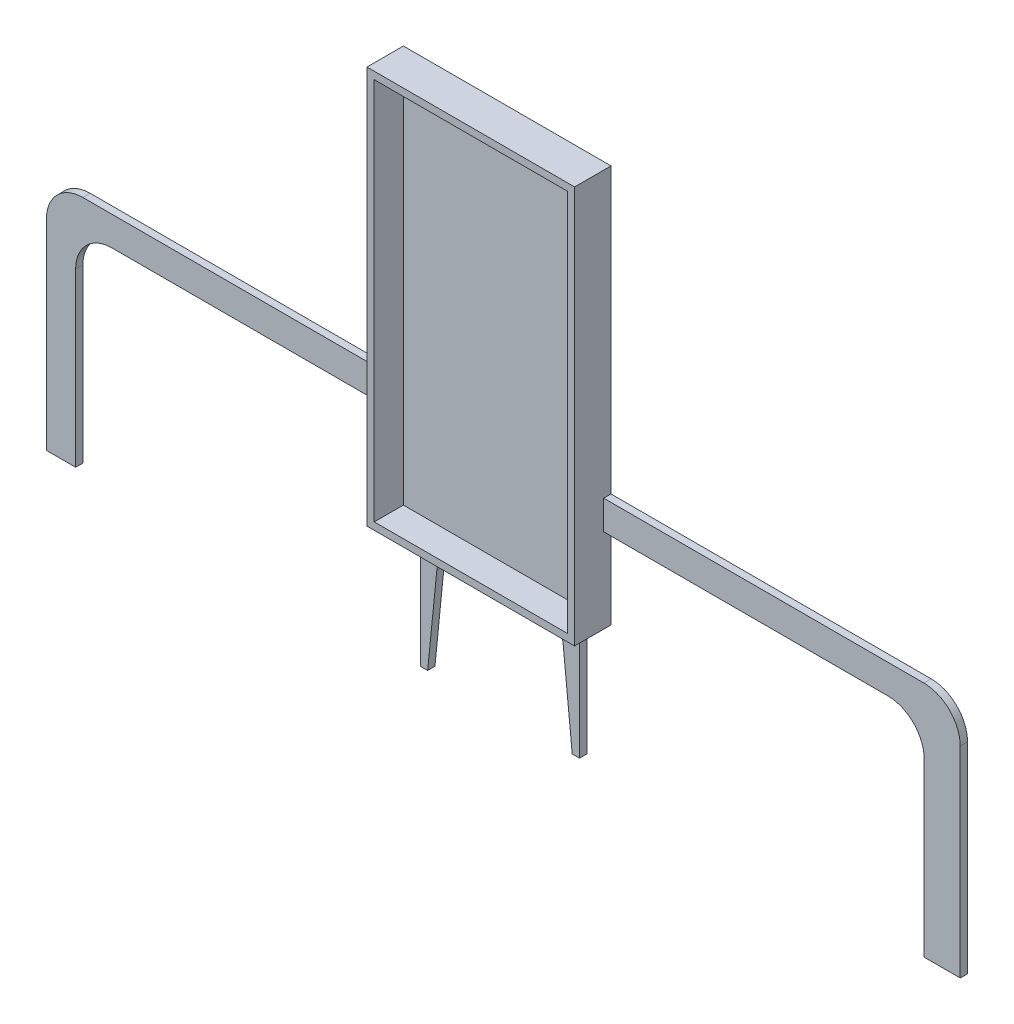
ISO-10303-21;
HEADER;
FILE_DESCRIPTION(('STEP AP214'),'2;1');
FILE_NAME('part.step','',(''),(''),'','','');
FILE_SCHEMA(('AUTOMOTIVE_DESIGN { 1 0 10303 214 1 1 1 1 }'));
ENDSEC;
DATA;
#1=APPLICATION_CONTEXT('core data for automotive mechanical design processes');
#2=APPLICATION_PROTOCOL_DEFINITION('international standard','automotive_design',2000,#1);
#3=PRODUCT_CONTEXT('',#1,'mechanical');
#4=PRODUCT('Part','Part','',(#3));
#5=PRODUCT_RELATED_PRODUCT_CATEGORY('part','',(#4));
#6=PRODUCT_DEFINITION_FORMATION('','',#4);
#7=PRODUCT_DEFINITION_CONTEXT('part definition',#1,'design');
#8=PRODUCT_DEFINITION('design','',#6,#7);
#9=PRODUCT_DEFINITION_SHAPE('','',#8);
#10=(LENGTH_UNIT() NAMED_UNIT(*) SI_UNIT(.MILLI.,.METRE.));
#11=(NAMED_UNIT(*) PLANE_ANGLE_UNIT() SI_UNIT($,.RADIAN.));
#12=(NAMED_UNIT(*) SI_UNIT($,.STERADIAN.) SOLID_ANGLE_UNIT());
#13=UNCERTAINTY_MEASURE_WITH_UNIT(LENGTH_MEASURE(1.E-05),#10,'distance_accuracy_value','');
#14=(GEOMETRIC_REPRESENTATION_CONTEXT(3) GLOBAL_UNCERTAINTY_ASSIGNED_CONTEXT((#13)) GLOBAL_UNIT_ASSIGNED_CONTEXT((#10,
#11,#12)) REPRESENTATION_CONTEXT('',''));
#15=CARTESIAN_POINT('',(0.,0.,0.));
#16=DIRECTION('',(0.,0.,1.));
#17=DIRECTION('',(1.,0.,0.));
#18=AXIS2_PLACEMENT_3D('',#15,#16,#17);
#19=CARTESIAN_POINT('',(0.,0.,1.));
#20=DIRECTION('',(0.,0.,1.));
#21=DIRECTION('',(1.,0.,0.));
#22=AXIS2_PLACEMENT_3D('',#19,#20,#21);
#23=PLANE('',#22);
#24=DIRECTION('',(0.,-1.,0.));
#25=VECTOR('',#24,1.);
#26=CARTESIAN_POINT('',(47.985038200003,17.,1.));
#27=LINE('',#26,#25);
#28=CARTESIAN_POINT('',(47.985038200003,32.5695975115487,1.));
#29=VERTEX_POINT('',#28);
#30=CARTESIAN_POINT('',(47.985038200003,28.5695975115487,1.));
#31=VERTEX_POINT('',#30);
#32=EDGE_CURVE('E12',#29,#31,#27,.T.);
#33=ORIENTED_EDGE('',*,*,#32,.F.);
#34=DIRECTION('',(1.,0.,0.));
#35=VECTOR('',#34,1.);
#36=CARTESIAN_POINT('',(0.,32.5695975115487,1.));
#37=LINE('',#36,#35);
#38=CARTESIAN_POINT('',(5.00000000000004,32.5695975115487,1.));
#39=VERTEX_POINT('',#38);
#40=EDGE_CURVE('E520',#39,#29,#37,.T.);
#41=ORIENTED_EDGE('',*,*,#40,.F.);
#42=CARTESIAN_POINT('',(5.,27.5695975115488,1.));
#43=DIRECTION('',(0.,0.,1.));
#44=DIRECTION('',(1.,0.,0.));
#45=AXIS2_PLACEMENT_3D('',#42,#43,#44);
#46=CIRCLE('',#45,5.);
#47=CARTESIAN_POINT('',(0.,27.5695975115487,1.));
#48=VERTEX_POINT('',#47);
#49=EDGE_CURVE('E522',#48,#39,#46,.F.);
#50=ORIENTED_EDGE('',*,*,#49,.F.);
#51=DIRECTION('',(0.,1.,0.));
#52=VECTOR('',#51,1.);
#53=CARTESIAN_POINT('',(0.,0.,1.));
#54=LINE('',#53,#52);
#55=CARTESIAN_POINT('',(0.,0.,1.));
#56=VERTEX_POINT('',#55);
#57=EDGE_CURVE('E549',#56,#48,#54,.T.);
#58=ORIENTED_EDGE('',*,*,#57,.F.);
#59=DIRECTION('',(1.,0.,0.));
#60=VECTOR('',#59,1.);
#61=CARTESIAN_POINT('',(0.,0.,1.));
#62=LINE('',#61,#60);
#63=CARTESIAN_POINT('',(4.,0.,1.));
#64=VERTEX_POINT('',#63);
#65=EDGE_CURVE('E546',#56,#64,#62,.T.);
#66=ORIENTED_EDGE('',*,*,#65,.T.);
#67=DIRECTION('',(0.,1.,0.));
#68=VECTOR('',#67,1.);
#69=CARTESIAN_POINT('',(4.,0.,1.));
#70=LINE('',#69,#68);
#71=CARTESIAN_POINT('',(4.,23.5695975115487,1.));
#72=VERTEX_POINT('',#71);
#73=EDGE_CURVE('E543',#64,#72,#70,.T.);
#74=ORIENTED_EDGE('',*,*,#73,.T.);
#75=CARTESIAN_POINT('',(9.,23.5695975115488,1.));
#76=DIRECTION('',(0.,0.,1.));
#77=DIRECTION('',(1.,0.,0.));
#78=AXIS2_PLACEMENT_3D('',#75,#76,#77);
#79=CIRCLE('',#78,5.);
#80=CARTESIAN_POINT('',(9.00000000000004,28.5695975115487,1.));
#81=VERTEX_POINT('',#80);
#82=EDGE_CURVE('E540',#72,#81,#79,.F.);
#83=ORIENTED_EDGE('',*,*,#82,.T.);
#84=DIRECTION('',(1.,0.,0.));
#85=VECTOR('',#84,1.);
#86=CARTESIAN_POINT('',(0.,28.5695975115487,1.));
#87=LINE('',#86,#85);
#88=EDGE_CURVE('E537',#81,#31,#87,.T.);
#89=ORIENTED_EDGE('',*,*,#88,.T.);
#90=EDGE_LOOP('',(#33,#41,#50,#58,#66,#74,#83,#89));
#91=FACE_BOUND('',#90,.T.);
#92=ADVANCED_FACE('F113',(#91),#23,.T.);
#93=DIRECTION('',(0.,1.,0.));
#94=VECTOR('',#93,1.);
#95=CARTESIAN_POINT('',(76.485038200003,71.5695975115488,1.));
#96=LINE('',#95,#94);
#97=CARTESIAN_POINT('',(76.485038200003,28.5695975115487,1.));
#98=VERTEX_POINT('',#97);
#99=CARTESIAN_POINT('',(76.485038200003,32.5695975115487,1.));
#100=VERTEX_POINT('',#99);
#101=EDGE_CURVE('E122',#98,#100,#96,.T.);
#102=ORIENTED_EDGE('',*,*,#101,.F.);
#103=DIRECTION('',(1.,0.,0.));
#104=VECTOR('',#103,1.);
#105=CARTESIAN_POINT('',(0.,28.5695975115487,1.));
#106=LINE('',#105,#104);
#107=CARTESIAN_POINT('',(115.470076400006,28.5695975115487,1.));
#108=VERTEX_POINT('',#107);
#109=EDGE_CURVE('E494',#98,#108,#106,.T.);
#110=ORIENTED_EDGE('',*,*,#109,.T.);
#111=CARTESIAN_POINT('',(115.470076400006,23.5695975115488,1.));
#112=DIRECTION('',(0.,0.,1.));
#113=DIRECTION('',(1.,0.,0.));
#114=AXIS2_PLACEMENT_3D('',#111,#112,#113);
#115=CIRCLE('',#114,5.);
#116=CARTESIAN_POINT('',(120.470076400006,23.5695975115487,1.));
#117=VERTEX_POINT('',#116);
#118=EDGE_CURVE('E492',#108,#117,#115,.F.);
#119=ORIENTED_EDGE('',*,*,#118,.T.);
#120=DIRECTION('',(0.,-1.,0.));
#121=VECTOR('',#120,1.);
#122=CARTESIAN_POINT('',(120.470076400006,0.,1.));
#123=LINE('',#122,#121);
#124=CARTESIAN_POINT('',(120.470076400006,0.,1.));
#125=VERTEX_POINT('',#124);
#126=EDGE_CURVE('E490',#117,#125,#123,.T.);
#127=ORIENTED_EDGE('',*,*,#126,.T.);
#128=DIRECTION('',(1.,0.,0.));
#129=VECTOR('',#128,1.);
#130=CARTESIAN_POINT('',(0.,0.,1.));
#131=LINE('',#130,#129);
#132=CARTESIAN_POINT('',(125.415873255215,0.,1.));
#133=VERTEX_POINT('',#132);
#134=EDGE_CURVE('E488',#125,#133,#131,.T.);
#135=ORIENTED_EDGE('',*,*,#134,.T.);
#136=DIRECTION('',(0.,-1.,0.));
#137=VECTOR('',#136,1.);
#138=CARTESIAN_POINT('',(125.415873255215,0.,1.));
#139=LINE('',#138,#137);
#140=CARTESIAN_POINT('',(125.415873255215,27.5695975115487,1.));
#141=VERTEX_POINT('',#140);
#142=EDGE_CURVE('E467',#141,#133,#139,.T.);
#143=ORIENTED_EDGE('',*,*,#142,.F.);
#144=CARTESIAN_POINT('',(120.415873255215,27.5695975115488,1.));
#145=DIRECTION('',(0.,0.,1.));
#146=DIRECTION('',(1.,0.,0.));
#147=AXIS2_PLACEMENT_3D('',#144,#145,#146);
#148=CIRCLE('',#147,5.);
#149=CARTESIAN_POINT('',(120.415873255215,32.5695975115487,1.));
#150=VERTEX_POINT('',#149);
#151=EDGE_CURVE('E471',#150,#141,#148,.F.);
#152=ORIENTED_EDGE('',*,*,#151,.F.);
#153=DIRECTION('',(1.,0.,0.));
#154=VECTOR('',#153,1.);
#155=CARTESIAN_POINT('',(0.,32.5695975115487,1.));
#156=LINE('',#155,#154);
#157=EDGE_CURVE('E496',#100,#150,#156,.T.);
#158=ORIENTED_EDGE('',*,*,#157,.F.);
#159=EDGE_LOOP('',(#102,#110,#119,#127,#135,#143,#152,#158));
#160=FACE_BOUND('',#159,.T.);
#161=ADVANCED_FACE('F691',(#160),#23,.T.);
#162=DIRECTION('',(1.,0.,0.));
#163=VECTOR('',#162,1.);
#164=CARTESIAN_POINT('',(76.485038200003,17.,1.));
#165=LINE('',#164,#163);
#166=CARTESIAN_POINT('',(51.319537582595,17.,1.));
#167=VERTEX_POINT('',#166);
#168=CARTESIAN_POINT('',(58.5431192774948,17.,1.));
#169=VERTEX_POINT('',#168);
#170=EDGE_CURVE('E435',#167,#169,#165,.T.);
#171=ORIENTED_EDGE('',*,*,#170,.F.);
#172=DIRECTION('',(0.,-1.,0.));
#173=VECTOR('',#172,1.);
#174=CARTESIAN_POINT('',(51.319537582595,0.,1.));
#175=LINE('',#174,#173);
#176=CARTESIAN_POINT('',(51.319537582595,0.,1.));
#177=VERTEX_POINT('',#176);
#178=EDGE_CURVE('E418',#167,#177,#175,.T.);
#179=ORIENTED_EDGE('',*,*,#178,.T.);
#180=DIRECTION('',(-1.,0.,0.));
#181=VECTOR('',#180,1.);
#182=CARTESIAN_POINT('',(0.,0.,1.));
#183=LINE('',#182,#181);
#184=CARTESIAN_POINT('',(52.319537582595,0.,1.));
#185=VERTEX_POINT('',#184);
#186=EDGE_CURVE('E348',#185,#177,#183,.T.);
#187=ORIENTED_EDGE('',*,*,#186,.F.);
#188=DIRECTION('',(0.0993968117697517,0.995047875134663,0.));
#189=VECTOR('',#188,1.);
#190=CARTESIAN_POINT('',(51.802634876892,-5.17464222245464,1.));
#191=LINE('',#190,#189);
#192=CARTESIAN_POINT('',(53.5678799018214,12.4969840588488,1.));
#193=VERTEX_POINT('',#192);
#194=EDGE_CURVE('E356',#185,#193,#191,.T.);
#195=ORIENTED_EDGE('',*,*,#194,.T.);
#196=CARTESIAN_POINT('',(58.5431192774948,12.,1.));
#197=DIRECTION('',(0.,0.,1.));
#198=DIRECTION('',(1.,0.,0.));
#199=AXIS2_PLACEMENT_3D('',#196,#197,#198);
#200=CIRCLE('',#199,5.00000000000001);
#201=EDGE_CURVE('E416',#193,#169,#200,.F.);
#202=ORIENTED_EDGE('',*,*,#201,.T.);
#203=EDGE_LOOP('',(#171,#179,#187,#195,#202));
#204=FACE_BOUND('',#203,.T.);
#205=ADVANCED_FACE('F428',(#204),#23,.T.);
#206=CARTESIAN_POINT('',(5.,27.5695975115488,1.));
#207=DIRECTION('',(0.,0.,-1.));
#208=DIRECTION('',(-1.,0.,0.));
#209=AXIS2_PLACEMENT_3D('',#206,#207,#208);
#210=CYLINDRICAL_SURFACE('',#209,5.);
#211=CARTESIAN_POINT('',(5.,27.5695975115488,0.));
#212=DIRECTION('',(0.,0.,1.));
#213=DIRECTION('',(1.,0.,0.));
#214=AXIS2_PLACEMENT_3D('',#211,#212,#213);
#215=CIRCLE('',#214,5.);
#216=CARTESIAN_POINT('',(0.,27.5695975115487,0.));
#217=VERTEX_POINT('',#216);
#218=CARTESIAN_POINT('',(5.00000000000004,32.5695975115487,0.));
#219=VERTEX_POINT('',#218);
#220=EDGE_CURVE('E449',#217,#219,#215,.F.);
#221=ORIENTED_EDGE('',*,*,#220,.F.);
#222=DIRECTION('',(0.,0.,-1.));
#223=VECTOR('',#222,1.);
#224=CARTESIAN_POINT('',(0.,27.5695975115487,1.));
#225=LINE('',#224,#223);
#226=EDGE_CURVE('E501',#48,#217,#225,.T.);
#227=ORIENTED_EDGE('',*,*,#226,.F.);
#228=ORIENTED_EDGE('',*,*,#49,.T.);
#229=DIRECTION('',(0.,0.,-1.));
#230=VECTOR('',#229,1.);
#231=CARTESIAN_POINT('',(5.00000000000004,32.5695975115487,1.));
#232=LINE('',#231,#230);
#233=EDGE_CURVE('E139',#39,#219,#232,.T.);
#234=ORIENTED_EDGE('',*,*,#233,.T.);
#235=EDGE_LOOP('',(#221,#227,#228,#234));
#236=FACE_BOUND('',#235,.T.);
#237=ADVANCED_FACE('F690',(#236),#210,.T.);
#238=CARTESIAN_POINT('',(0.,0.,1.));
#239=DIRECTION('',(-1.,0.,0.));
#240=DIRECTION('',(0.,0.,1.));
#241=AXIS2_PLACEMENT_3D('',#238,#239,#240);
#242=PLANE('',#241);
#243=DIRECTION('',(0.,1.,0.));
#244=VECTOR('',#243,1.);
#245=CARTESIAN_POINT('',(0.,0.,0.));
#246=LINE('',#245,#244);
#247=CARTESIAN_POINT('',(0.,0.,0.));
#248=VERTEX_POINT('',#247);
#249=EDGE_CURVE('E532',#248,#217,#246,.T.);
#250=ORIENTED_EDGE('',*,*,#249,.F.);
#251=DIRECTION('',(0.,0.,-1.));
#252=VECTOR('',#251,1.);
#253=CARTESIAN_POINT('',(0.,0.,1.));
#254=LINE('',#253,#252);
#255=EDGE_CURVE('E504',#56,#248,#254,.T.);
#256=ORIENTED_EDGE('',*,*,#255,.F.);
#257=ORIENTED_EDGE('',*,*,#57,.T.);
#258=ORIENTED_EDGE('',*,*,#226,.T.);
#259=EDGE_LOOP('',(#250,#256,#257,#258));
#260=FACE_BOUND('',#259,.T.);
#261=ADVANCED_FACE('F651',(#260),#242,.T.);
#262=CARTESIAN_POINT('',(0.,0.,1.));
#263=DIRECTION('',(0.,1.,0.));
#264=DIRECTION('',(0.,0.,1.));
#265=AXIS2_PLACEMENT_3D('',#262,#263,#264);
#266=PLANE('',#265);
#267=DIRECTION('',(1.,0.,0.));
#268=VECTOR('',#267,1.);
#269=CARTESIAN_POINT('',(0.,0.,0.));
#270=LINE('',#269,#268);
#271=CARTESIAN_POINT('',(4.,0.,0.));
#272=VERTEX_POINT('',#271);
#273=EDGE_CURVE('E530',#248,#272,#270,.T.);
#274=ORIENTED_EDGE('',*,*,#273,.T.);
#275=DIRECTION('',(0.,0.,-1.));
#276=VECTOR('',#275,1.);
#277=CARTESIAN_POINT('',(4.,0.,1.));
#278=LINE('',#277,#276);
#279=EDGE_CURVE('E506',#64,#272,#278,.T.);
#280=ORIENTED_EDGE('',*,*,#279,.F.);
#281=ORIENTED_EDGE('',*,*,#65,.F.);
#282=ORIENTED_EDGE('',*,*,#255,.T.);
#283=EDGE_LOOP('',(#274,#280,#281,#282));
#284=FACE_BOUND('',#283,.T.);
#285=ADVANCED_FACE('F657',(#284),#266,.F.);
#286=CARTESIAN_POINT('',(4.,0.,1.));
#287=DIRECTION('',(-1.,0.,0.));
#288=DIRECTION('',(0.,0.,1.));
#289=AXIS2_PLACEMENT_3D('',#286,#287,#288);
#290=PLANE('',#289);
#291=DIRECTION('',(0.,1.,0.));
#292=VECTOR('',#291,1.);
#293=CARTESIAN_POINT('',(4.,0.,0.));
#294=LINE('',#293,#292);
#295=CARTESIAN_POINT('',(4.,23.5695975115487,0.));
#296=VERTEX_POINT('',#295);
#297=EDGE_CURVE('E528',#272,#296,#294,.T.);
#298=ORIENTED_EDGE('',*,*,#297,.T.);
#299=DIRECTION('',(0.,0.,-1.));
#300=VECTOR('',#299,1.);
#301=CARTESIAN_POINT('',(4.,23.5695975115487,1.));
#302=LINE('',#301,#300);
#303=EDGE_CURVE('E509',#72,#296,#302,.T.);
#304=ORIENTED_EDGE('',*,*,#303,.F.);
#305=ORIENTED_EDGE('',*,*,#73,.F.);
#306=ORIENTED_EDGE('',*,*,#279,.T.);
#307=EDGE_LOOP('',(#298,#304,#305,#306));
#308=FACE_BOUND('',#307,.T.);
#309=ADVANCED_FACE('F661',(#308),#290,.F.);
#310=CARTESIAN_POINT('',(9.,23.5695975115488,1.));
#311=DIRECTION('',(0.,0.,-1.));
#312=DIRECTION('',(-1.,0.,0.));
#313=AXIS2_PLACEMENT_3D('',#310,#311,#312);
#314=CYLINDRICAL_SURFACE('',#313,5.);
#315=CARTESIAN_POINT('',(9.,23.5695975115488,0.));
#316=DIRECTION('',(0.,0.,1.));
#317=DIRECTION('',(1.,0.,0.));
#318=AXIS2_PLACEMENT_3D('',#315,#316,#317);
#319=CIRCLE('',#318,5.);
#320=CARTESIAN_POINT('',(9.00000000000004,28.5695975115487,0.));
#321=VERTEX_POINT('',#320);
#322=EDGE_CURVE('E526',#296,#321,#319,.F.);
#323=ORIENTED_EDGE('',*,*,#322,.T.);
#324=DIRECTION('',(0.,0.,-1.));
#325=VECTOR('',#324,1.);
#326=CARTESIAN_POINT('',(9.00000000000004,28.5695975115487,1.));
#327=LINE('',#326,#325);
#328=EDGE_CURVE('E512',#81,#321,#327,.T.);
#329=ORIENTED_EDGE('',*,*,#328,.F.);
#330=ORIENTED_EDGE('',*,*,#82,.F.);
#331=ORIENTED_EDGE('',*,*,#303,.T.);
#332=EDGE_LOOP('',(#323,#329,#330,#331));
#333=FACE_BOUND('',#332,.T.);
#334=ADVANCED_FACE('F665',(#333),#314,.F.);
#335=CARTESIAN_POINT('',(0.,28.5695975115487,1.));
#336=DIRECTION('',(0.,1.,0.));
#337=DIRECTION('',(0.,0.,1.));
#338=AXIS2_PLACEMENT_3D('',#335,#336,#337);
#339=PLANE('',#338);
#340=DIRECTION('',(1.,0.,0.));
#341=VECTOR('',#340,1.);
#342=CARTESIAN_POINT('',(0.,28.5695975115487,0.));
#343=LINE('',#342,#341);
#344=CARTESIAN_POINT('',(47.985038200003,28.5695975115487,0.));
#345=VERTEX_POINT('',#344);
#346=EDGE_CURVE('E523',#321,#345,#343,.T.);
#347=ORIENTED_EDGE('',*,*,#346,.T.);
#348=DIRECTION('',(0.,0.,-1.));
#349=VECTOR('',#348,1.);
#350=CARTESIAN_POINT('',(47.985038200003,28.5695975115487,1.));
#351=LINE('',#350,#349);
#352=EDGE_CURVE('E515',#31,#345,#351,.T.);
#353=ORIENTED_EDGE('',*,*,#352,.F.);
#354=ORIENTED_EDGE('',*,*,#88,.F.);
#355=ORIENTED_EDGE('',*,*,#328,.T.);
#356=EDGE_LOOP('',(#347,#353,#354,#355));
#357=FACE_BOUND('',#356,.T.);
#358=ADVANCED_FACE('F638',(#357),#339,.F.);
#359=CARTESIAN_POINT('',(0.,32.5695975115487,1.));
#360=DIRECTION('',(0.,1.,0.));
#361=DIRECTION('',(0.,0.,1.));
#362=AXIS2_PLACEMENT_3D('',#359,#360,#361);
#363=PLANE('',#362);
#364=DIRECTION('',(1.,0.,0.));
#365=VECTOR('',#364,1.);
#366=CARTESIAN_POINT('',(0.,32.5695975115487,0.));
#367=LINE('',#366,#365);
#368=CARTESIAN_POINT('',(47.985038200003,32.5695975115487,0.));
#369=VERTEX_POINT('',#368);
#370=EDGE_CURVE('E314',#219,#369,#367,.T.);
#371=ORIENTED_EDGE('',*,*,#370,.F.);
#372=ORIENTED_EDGE('',*,*,#233,.F.);
#373=ORIENTED_EDGE('',*,*,#40,.T.);
#374=DIRECTION('',(0.,0.,-1.));
#375=VECTOR('',#374,1.);
#376=CARTESIAN_POINT('',(47.985038200003,32.5695975115487,1.));
#377=LINE('',#376,#375);
#378=EDGE_CURVE('E517',#29,#369,#377,.T.);
#379=ORIENTED_EDGE('',*,*,#378,.T.);
#380=EDGE_LOOP('',(#371,#372,#373,#379));
#381=FACE_BOUND('',#380,.T.);
#382=ADVANCED_FACE('F645',(#381),#363,.T.);
#383=CARTESIAN_POINT('',(65.9353023409986,17.,1.));
#384=VERTEX_POINT('',#383);
#385=CARTESIAN_POINT('',(73.1588840358984,17.,1.));
#386=VERTEX_POINT('',#385);
#387=EDGE_CURVE('E503',#384,#386,#165,.T.);
#388=ORIENTED_EDGE('',*,*,#387,.F.);
#389=CARTESIAN_POINT('',(65.9353023409986,12.,1.));
#390=DIRECTION('',(0.,0.,1.));
#391=DIRECTION('',(1.,0.,0.));
#392=AXIS2_PLACEMENT_3D('',#389,#390,#391);
#393=CIRCLE('',#392,5.00000000000001);
#394=CARTESIAN_POINT('',(70.910541716672,12.4969840588488,1.));
#395=VERTEX_POINT('',#394);
#396=EDGE_CURVE('E394',#395,#384,#393,.T.);
#397=ORIENTED_EDGE('',*,*,#396,.F.);
#398=DIRECTION('',(-0.0993968117697523,0.995047875134663,0.));
#399=VECTOR('',#398,1.);
#400=CARTESIAN_POINT('',(71.4459740194484,7.13684457680657,1.));
#401=LINE('',#400,#399);
#402=CARTESIAN_POINT('',(72.1588840358984,0.,1.));
#403=VERTEX_POINT('',#402);
#404=EDGE_CURVE('E398',#403,#395,#401,.T.);
#405=ORIENTED_EDGE('',*,*,#404,.F.);
#406=DIRECTION('',(1.,0.,0.));
#407=VECTOR('',#406,1.);
#408=CARTESIAN_POINT('',(0.,4.26921882907255E-13,1.));
#409=LINE('',#408,#407);
#410=CARTESIAN_POINT('',(73.1588840358984,0.,1.));
#411=VERTEX_POINT('',#410);
#412=EDGE_CURVE('E443',#403,#411,#409,.T.);
#413=ORIENTED_EDGE('',*,*,#412,.T.);
#414=DIRECTION('',(0.,-1.,0.));
#415=VECTOR('',#414,1.);
#416=CARTESIAN_POINT('',(73.1588840358984,0.,1.));
#417=LINE('',#416,#415);
#418=EDGE_CURVE('E405',#386,#411,#417,.T.);
#419=ORIENTED_EDGE('',*,*,#418,.F.);
#420=EDGE_LOOP('',(#388,#397,#405,#413,#419));
#421=FACE_BOUND('',#420,.T.);
#422=ADVANCED_FACE('F680',(#421),#23,.T.);
#423=CARTESIAN_POINT('',(0.,0.,0.));
#424=DIRECTION('',(0.,0.,1.));
#425=DIRECTION('',(1.,0.,0.));
#426=AXIS2_PLACEMENT_3D('',#423,#424,#425);
#427=PLANE('',#426);
#428=ORIENTED_EDGE('',*,*,#220,.T.);
#429=ORIENTED_EDGE('',*,*,#370,.T.);
#430=DIRECTION('',(0.,-1.,0.));
#431=VECTOR('',#430,1.);
#432=CARTESIAN_POINT('',(47.985038200003,71.5695975115487,0.));
#433=LINE('',#432,#431);
#434=CARTESIAN_POINT('',(47.985038200003,71.5695975115487,0.));
#435=VERTEX_POINT('',#434);
#436=EDGE_CURVE('E297',#435,#369,#433,.T.);
#437=ORIENTED_EDGE('',*,*,#436,.F.);
#438=DIRECTION('',(1.,0.,0.));
#439=VECTOR('',#438,1.);
#440=CARTESIAN_POINT('',(47.985038200003,71.5695975115487,0.));
#441=LINE('',#440,#439);
#442=CARTESIAN_POINT('',(76.485038200003,71.5695975115488,0.));
#443=VERTEX_POINT('',#442);
#444=EDGE_CURVE('E307',#435,#443,#441,.T.);
#445=ORIENTED_EDGE('',*,*,#444,.T.);
#446=DIRECTION('',(0.,-1.,0.));
#447=VECTOR('',#446,1.);
#448=CARTESIAN_POINT('',(76.485038200003,71.5695975115488,0.));
#449=LINE('',#448,#447);
#450=CARTESIAN_POINT('',(76.485038200003,32.5695975115487,0.));
#451=VERTEX_POINT('',#450);
#452=EDGE_CURVE('E321',#443,#451,#449,.T.);
#453=ORIENTED_EDGE('',*,*,#452,.T.);
#454=DIRECTION('',(1.,0.,0.));
#455=VECTOR('',#454,1.);
#456=CARTESIAN_POINT('',(0.,32.5695975115487,0.));
#457=LINE('',#456,#455);
#458=CARTESIAN_POINT('',(120.415873255215,32.5695975115487,0.));
#459=VERTEX_POINT('',#458);
#460=EDGE_CURVE('E481',#451,#459,#457,.T.);
#461=ORIENTED_EDGE('',*,*,#460,.T.);
#462=CARTESIAN_POINT('',(120.415873255215,27.5695975115488,0.));
#463=DIRECTION('',(0.,0.,1.));
#464=DIRECTION('',(1.,0.,0.));
#465=AXIS2_PLACEMENT_3D('',#462,#463,#464);
#466=CIRCLE('',#465,5.);
#467=CARTESIAN_POINT('',(125.415873255215,27.5695975115487,0.));
#468=VERTEX_POINT('',#467);
#469=EDGE_CURVE('E413',#459,#468,#466,.F.);
#470=ORIENTED_EDGE('',*,*,#469,.T.);
#471=DIRECTION('',(0.,-1.,0.));
#472=VECTOR('',#471,1.);
#473=CARTESIAN_POINT('',(125.415873255215,0.,0.));
#474=LINE('',#473,#472);
#475=CARTESIAN_POINT('',(125.415873255215,0.,0.));
#476=VERTEX_POINT('',#475);
#477=EDGE_CURVE('E468',#468,#476,#474,.T.);
#478=ORIENTED_EDGE('',*,*,#477,.T.);
#479=DIRECTION('',(1.,0.,0.));
#480=VECTOR('',#479,1.);
#481=CARTESIAN_POINT('',(0.,0.,0.));
#482=LINE('',#481,#480);
#483=CARTESIAN_POINT('',(120.470076400006,0.,0.));
#484=VERTEX_POINT('',#483);
#485=EDGE_CURVE('E472',#484,#476,#482,.T.);
#486=ORIENTED_EDGE('',*,*,#485,.F.);
#487=DIRECTION('',(0.,-1.,0.));
#488=VECTOR('',#487,1.);
#489=CARTESIAN_POINT('',(120.470076400006,0.,0.));
#490=LINE('',#489,#488);
#491=CARTESIAN_POINT('',(120.470076400006,23.5695975115487,0.));
#492=VERTEX_POINT('',#491);
#493=EDGE_CURVE('E475',#492,#484,#490,.T.);
#494=ORIENTED_EDGE('',*,*,#493,.F.);
#495=CARTESIAN_POINT('',(115.470076400006,23.5695975115488,0.));
#496=DIRECTION('',(0.,0.,1.));
#497=DIRECTION('',(1.,0.,0.));
#498=AXIS2_PLACEMENT_3D('',#495,#496,#497);
#499=CIRCLE('',#498,5.);
#500=CARTESIAN_POINT('',(115.470076400006,28.5695975115487,0.));
#501=VERTEX_POINT('',#500);
#502=EDGE_CURVE('E477',#501,#492,#499,.F.);
#503=ORIENTED_EDGE('',*,*,#502,.F.);
#504=DIRECTION('',(1.,0.,0.));
#505=VECTOR('',#504,1.);
#506=CARTESIAN_POINT('',(0.,28.5695975115487,0.));
#507=LINE('',#506,#505);
#508=CARTESIAN_POINT('',(76.485038200003,28.5695975115487,0.));
#509=VERTEX_POINT('',#508);
#510=EDGE_CURVE('E479',#509,#501,#507,.T.);
#511=ORIENTED_EDGE('',*,*,#510,.F.);
#512=CARTESIAN_POINT('',(76.485038200003,17.,0.));
#513=VERTEX_POINT('',#512);
#514=EDGE_CURVE('E323',#509,#513,#449,.T.);
#515=ORIENTED_EDGE('',*,*,#514,.T.);
#516=DIRECTION('',(1.,0.,0.));
#517=VECTOR('',#516,1.);
#518=CARTESIAN_POINT('',(47.985038200003,17.,0.));
#519=LINE('',#518,#517);
#520=CARTESIAN_POINT('',(73.1588840358984,17.,0.));
#521=VERTEX_POINT('',#520);
#522=EDGE_CURVE('E315',#521,#513,#519,.T.);
#523=ORIENTED_EDGE('',*,*,#522,.F.);
#524=DIRECTION('',(0.,-1.,0.));
#525=VECTOR('',#524,1.);
#526=CARTESIAN_POINT('',(73.1588840358984,0.,0.));
#527=LINE('',#526,#525);
#528=CARTESIAN_POINT('',(73.1588840358984,0.,0.));
#529=VERTEX_POINT('',#528);
#530=EDGE_CURVE('E385',#521,#529,#527,.T.);
#531=ORIENTED_EDGE('',*,*,#530,.T.);
#532=DIRECTION('',(1.,0.,0.));
#533=VECTOR('',#532,1.);
#534=CARTESIAN_POINT('',(0.,4.26921882907255E-13,0.));
#535=LINE('',#534,#533);
#536=CARTESIAN_POINT('',(72.1588840358984,0.,0.));
#537=VERTEX_POINT('',#536);
#538=EDGE_CURVE('E395',#537,#529,#535,.T.);
#539=ORIENTED_EDGE('',*,*,#538,.F.);
#540=DIRECTION('',(-0.0993968117697523,0.995047875134663,0.));
#541=VECTOR('',#540,1.);
#542=CARTESIAN_POINT('',(71.4459740194484,7.13684457680657,0.));
#543=LINE('',#542,#541);
#544=CARTESIAN_POINT('',(70.910541716672,12.4969840588488,0.));
#545=VERTEX_POINT('',#544);
#546=EDGE_CURVE('E400',#537,#545,#543,.T.);
#547=ORIENTED_EDGE('',*,*,#546,.T.);
#548=CARTESIAN_POINT('',(65.9353023409986,12.,0.));
#549=DIRECTION('',(0.,0.,1.));
#550=DIRECTION('',(1.,0.,0.));
#551=AXIS2_PLACEMENT_3D('',#548,#549,#550);
#552=CIRCLE('',#551,5.00000000000001);
#553=CARTESIAN_POINT('',(65.9353023409986,17.,0.));
#554=VERTEX_POINT('',#553);
#555=EDGE_CURVE('E367',#545,#554,#552,.T.);
#556=ORIENTED_EDGE('',*,*,#555,.T.);
#557=CARTESIAN_POINT('',(58.5431192774948,17.,0.));
#558=VERTEX_POINT('',#557);
#559=EDGE_CURVE('E369',#558,#554,#519,.T.);
#560=ORIENTED_EDGE('',*,*,#559,.F.);
#561=CARTESIAN_POINT('',(58.5431192774948,12.,0.));
#562=DIRECTION('',(0.,0.,1.));
#563=DIRECTION('',(1.,0.,0.));
#564=AXIS2_PLACEMENT_3D('',#561,#562,#563);
#565=CIRCLE('',#564,5.00000000000001);
#566=CARTESIAN_POINT('',(53.5678799018214,12.4969840588488,0.));
#567=VERTEX_POINT('',#566);
#568=EDGE_CURVE('E339',#567,#558,#565,.F.);
#569=ORIENTED_EDGE('',*,*,#568,.F.);
#570=DIRECTION('',(0.0993968117697517,0.995047875134663,0.));
#571=VECTOR('',#570,1.);
#572=CARTESIAN_POINT('',(51.802634876892,-5.17464222245464,0.));
#573=LINE('',#572,#571);
#574=CARTESIAN_POINT('',(52.319537582595,0.,0.));
#575=VERTEX_POINT('',#574);
#576=EDGE_CURVE('E334',#575,#567,#573,.T.);
#577=ORIENTED_EDGE('',*,*,#576,.F.);
#578=DIRECTION('',(-1.,0.,0.));
#579=VECTOR('',#578,1.);
#580=CARTESIAN_POINT('',(0.,0.,0.));
#581=LINE('',#580,#579);
#582=CARTESIAN_POINT('',(51.319537582595,0.,0.));
#583=VERTEX_POINT('',#582);
#584=EDGE_CURVE('E353',#575,#583,#581,.T.);
#585=ORIENTED_EDGE('',*,*,#584,.T.);
#586=DIRECTION('',(0.,-1.,0.));
#587=VECTOR('',#586,1.);
#588=CARTESIAN_POINT('',(51.319537582595,0.,0.));
#589=LINE('',#588,#587);
#590=CARTESIAN_POINT('',(51.319537582595,17.,0.));
#591=VERTEX_POINT('',#590);
#592=EDGE_CURVE('E345',#591,#583,#589,.T.);
#593=ORIENTED_EDGE('',*,*,#592,.F.);
#594=CARTESIAN_POINT('',(47.985038200003,17.,0.));
#595=VERTEX_POINT('',#594);
#596=EDGE_CURVE('E368',#595,#591,#519,.T.);
#597=ORIENTED_EDGE('',*,*,#596,.F.);
#598=EDGE_CURVE('E316',#345,#595,#433,.T.);
#599=ORIENTED_EDGE('',*,*,#598,.F.);
#600=ORIENTED_EDGE('',*,*,#346,.F.);
#601=ORIENTED_EDGE('',*,*,#322,.F.);
#602=ORIENTED_EDGE('',*,*,#297,.F.);
#603=ORIENTED_EDGE('',*,*,#273,.F.);
#604=ORIENTED_EDGE('',*,*,#249,.T.);
#605=EDGE_LOOP('',(#428,#429,#437,#445,#453,#461,#470,#478,#486,#494,#503,#511,#515,#523,#531,
#539,#547,#556,#560,#569,#577,#585,#593,#597,#599,#600,#601,#602,#603,#604));
#606=FACE_BOUND('',#605,.T.);
#607=ADVANCED_FACE('F312',(#606),#427,.F.);
#608=CARTESIAN_POINT('',(125.415873255215,0.,1.));
#609=DIRECTION('',(1.,0.,0.));
#610=DIRECTION('',(0.,0.,-1.));
#611=AXIS2_PLACEMENT_3D('',#608,#609,#610);
#612=PLANE('',#611);
#613=ORIENTED_EDGE('',*,*,#477,.F.);
#614=DIRECTION('',(0.,0.,-1.));
#615=VECTOR('',#614,1.);
#616=CARTESIAN_POINT('',(125.415873255215,27.5695975115487,1.));
#617=LINE('',#616,#615);
#618=EDGE_CURVE('E465',#141,#468,#617,.T.);
#619=ORIENTED_EDGE('',*,*,#618,.F.);
#620=ORIENTED_EDGE('',*,*,#142,.T.);
#621=DIRECTION('',(0.,0.,-1.));
#622=VECTOR('',#621,1.);
#623=CARTESIAN_POINT('',(125.415873255215,0.,1.));
#624=LINE('',#623,#622);
#625=EDGE_CURVE('E463',#133,#476,#624,.T.);
#626=ORIENTED_EDGE('',*,*,#625,.T.);
#627=EDGE_LOOP('',(#613,#619,#620,#626));
#628=FACE_BOUND('',#627,.T.);
#629=ADVANCED_FACE('F726',(#628),#612,.T.);
#630=CARTESIAN_POINT('',(0.,0.,1.));
#631=DIRECTION('',(0.,1.,0.));
#632=DIRECTION('',(0.,0.,1.));
#633=AXIS2_PLACEMENT_3D('',#630,#631,#632);
#634=PLANE('',#633);
#635=ORIENTED_EDGE('',*,*,#485,.T.);
#636=ORIENTED_EDGE('',*,*,#625,.F.);
#637=ORIENTED_EDGE('',*,*,#134,.F.);
#638=DIRECTION('',(0.,0.,-1.));
#639=VECTOR('',#638,1.);
#640=CARTESIAN_POINT('',(120.470076400006,0.,1.));
#641=LINE('',#640,#639);
#642=EDGE_CURVE('E460',#125,#484,#641,.T.);
#643=ORIENTED_EDGE('',*,*,#642,.T.);
#644=EDGE_LOOP('',(#635,#636,#637,#643));
#645=FACE_BOUND('',#644,.T.);
#646=ADVANCED_FACE('F723',(#645),#634,.F.);
#647=CARTESIAN_POINT('',(120.470076400006,0.,1.));
#648=DIRECTION('',(1.,0.,0.));
#649=DIRECTION('',(0.,0.,-1.));
#650=AXIS2_PLACEMENT_3D('',#647,#648,#649);
#651=PLANE('',#650);
#652=ORIENTED_EDGE('',*,*,#493,.T.);
#653=ORIENTED_EDGE('',*,*,#642,.F.);
#654=ORIENTED_EDGE('',*,*,#126,.F.);
#655=DIRECTION('',(0.,0.,-1.));
#656=VECTOR('',#655,1.);
#657=CARTESIAN_POINT('',(120.470076400006,23.5695975115487,1.));
#658=LINE('',#657,#656);
#659=EDGE_CURVE('E457',#117,#492,#658,.T.);
#660=ORIENTED_EDGE('',*,*,#659,.T.);
#661=EDGE_LOOP('',(#652,#653,#654,#660));
#662=FACE_BOUND('',#661,.T.);
#663=ADVANCED_FACE('F719',(#662),#651,.F.);
#664=CARTESIAN_POINT('',(115.470076400006,23.5695975115488,1.));
#665=DIRECTION('',(0.,0.,-1.));
#666=DIRECTION('',(-1.,0.,0.));
#667=AXIS2_PLACEMENT_3D('',#664,#665,#666);
#668=CYLINDRICAL_SURFACE('',#667,5.);
#669=ORIENTED_EDGE('',*,*,#502,.T.);
#670=ORIENTED_EDGE('',*,*,#659,.F.);
#671=ORIENTED_EDGE('',*,*,#118,.F.);
#672=DIRECTION('',(0.,0.,-1.));
#673=VECTOR('',#672,1.);
#674=CARTESIAN_POINT('',(115.470076400006,28.5695975115487,1.));
#675=LINE('',#674,#673);
#676=EDGE_CURVE('E454',#108,#501,#675,.T.);
#677=ORIENTED_EDGE('',*,*,#676,.T.);
#678=EDGE_LOOP('',(#669,#670,#671,#677));
#679=FACE_BOUND('',#678,.T.);
#680=ADVANCED_FACE('F712',(#679),#668,.F.);
#681=CARTESIAN_POINT('',(0.,32.5695975115487,1.));
#682=DIRECTION('',(0.,1.,0.));
#683=DIRECTION('',(0.,0.,1.));
#684=AXIS2_PLACEMENT_3D('',#681,#682,#683);
#685=PLANE('',#684);
#686=ORIENTED_EDGE('',*,*,#460,.F.);
#687=DIRECTION('',(0.,0.,-1.));
#688=VECTOR('',#687,1.);
#689=CARTESIAN_POINT('',(76.485038200003,32.5695975115487,1.));
#690=LINE('',#689,#688);
#691=EDGE_CURVE('E450',#100,#451,#690,.T.);
#692=ORIENTED_EDGE('',*,*,#691,.F.);
#693=ORIENTED_EDGE('',*,*,#157,.T.);
#694=DIRECTION('',(0.,0.,-1.));
#695=VECTOR('',#694,1.);
#696=CARTESIAN_POINT('',(120.415873255215,32.5695975115487,1.));
#697=LINE('',#696,#695);
#698=EDGE_CURVE('E447',#150,#459,#697,.T.);
#699=ORIENTED_EDGE('',*,*,#698,.T.);
#700=EDGE_LOOP('',(#686,#692,#693,#699));
#701=FACE_BOUND('',#700,.T.);
#702=ADVANCED_FACE('F730',(#701),#685,.T.);
#703=CARTESIAN_POINT('',(120.415873255215,27.5695975115488,1.));
#704=DIRECTION('',(0.,0.,-1.));
#705=DIRECTION('',(-1.,0.,0.));
#706=AXIS2_PLACEMENT_3D('',#703,#704,#705);
#707=CYLINDRICAL_SURFACE('',#706,5.);
#708=ORIENTED_EDGE('',*,*,#469,.F.);
#709=ORIENTED_EDGE('',*,*,#698,.F.);
#710=ORIENTED_EDGE('',*,*,#151,.T.);
#711=ORIENTED_EDGE('',*,*,#618,.T.);
#712=EDGE_LOOP('',(#708,#709,#710,#711));
#713=FACE_BOUND('',#712,.T.);
#714=ADVANCED_FACE('F732',(#713),#707,.T.);
#715=CARTESIAN_POINT('',(0.,28.5695975115487,1.));
#716=DIRECTION('',(0.,1.,0.));
#717=DIRECTION('',(0.,0.,1.));
#718=AXIS2_PLACEMENT_3D('',#715,#716,#717);
#719=PLANE('',#718);
#720=ORIENTED_EDGE('',*,*,#510,.T.);
#721=ORIENTED_EDGE('',*,*,#676,.F.);
#722=ORIENTED_EDGE('',*,*,#109,.F.);
#723=DIRECTION('',(0.,0.,-1.));
#724=VECTOR('',#723,1.);
#725=CARTESIAN_POINT('',(76.485038200003,28.5695975115487,1.));
#726=LINE('',#725,#724);
#727=EDGE_CURVE('E452',#98,#509,#726,.T.);
#728=ORIENTED_EDGE('',*,*,#727,.T.);
#729=EDGE_LOOP('',(#720,#721,#722,#728));
#730=FACE_BOUND('',#729,.T.);
#731=ADVANCED_FACE('F707',(#730),#719,.F.);
#732=CARTESIAN_POINT('',(73.1588840358984,0.,1.));
#733=DIRECTION('',(1.,0.,0.));
#734=DIRECTION('',(0.,0.,-1.));
#735=AXIS2_PLACEMENT_3D('',#732,#733,#734);
#736=PLANE('',#735);
#737=ORIENTED_EDGE('',*,*,#530,.F.);
#738=DIRECTION('',(0.,0.,-1.));
#739=VECTOR('',#738,1.);
#740=CARTESIAN_POINT('',(73.1588840358984,17.,1.));
#741=LINE('',#740,#739);
#742=EDGE_CURVE('E381',#386,#521,#741,.T.);
#743=ORIENTED_EDGE('',*,*,#742,.F.);
#744=ORIENTED_EDGE('',*,*,#418,.T.);
#745=DIRECTION('',(0.,0.,-1.));
#746=VECTOR('',#745,1.);
#747=CARTESIAN_POINT('',(73.1588840358984,0.,1.));
#748=LINE('',#747,#746);
#749=EDGE_CURVE('E392',#411,#529,#748,.T.);
#750=ORIENTED_EDGE('',*,*,#749,.T.);
#751=EDGE_LOOP('',(#737,#743,#744,#750));
#752=FACE_BOUND('',#751,.T.);
#753=ADVANCED_FACE('F388',(#752),#736,.T.);
#754=CARTESIAN_POINT('',(0.,4.26921882907255E-13,1.));
#755=DIRECTION('',(0.,1.,0.));
#756=DIRECTION('',(-1.,0.,0.));
#757=AXIS2_PLACEMENT_3D('',#754,#755,#756);
#758=PLANE('',#757);
#759=ORIENTED_EDGE('',*,*,#538,.T.);
#760=ORIENTED_EDGE('',*,*,#749,.F.);
#761=ORIENTED_EDGE('',*,*,#412,.F.);
#762=DIRECTION('',(0.,0.,-1.));
#763=VECTOR('',#762,1.);
#764=CARTESIAN_POINT('',(72.1588840358984,0.,1.));
#765=LINE('',#764,#763);
#766=EDGE_CURVE('E407',#403,#537,#765,.T.);
#767=ORIENTED_EDGE('',*,*,#766,.T.);
#768=EDGE_LOOP('',(#759,#760,#761,#767));
#769=FACE_BOUND('',#768,.T.);
#770=ADVANCED_FACE('F774',(#769),#758,.F.);
#771=CARTESIAN_POINT('',(71.4459740194484,7.13684457680657,1.));
#772=DIRECTION('',(-0.995047875134663,-0.0993968117697523,0.));
#773=DIRECTION('',(0.0993968117697523,-0.995047875134663,0.));
#774=AXIS2_PLACEMENT_3D('',#771,#772,#773);
#775=PLANE('',#774);
#776=ORIENTED_EDGE('',*,*,#546,.F.);
#777=ORIENTED_EDGE('',*,*,#766,.F.);
#778=ORIENTED_EDGE('',*,*,#404,.T.);
#779=DIRECTION('',(0.,0.,-1.));
#780=VECTOR('',#779,1.);
#781=CARTESIAN_POINT('',(70.910541716672,12.4969840588488,1.));
#782=LINE('',#781,#780);
#783=EDGE_CURVE('E409',#395,#545,#782,.T.);
#784=ORIENTED_EDGE('',*,*,#783,.T.);
#785=EDGE_LOOP('',(#776,#777,#778,#784));
#786=FACE_BOUND('',#785,.T.);
#787=ADVANCED_FACE('F770',(#786),#775,.T.);
#788=CARTESIAN_POINT('',(65.9353023409986,12.,1.));
#789=DIRECTION('',(0.,0.,-1.));
#790=DIRECTION('',(-1.,0.,0.));
#791=AXIS2_PLACEMENT_3D('',#788,#789,#790);
#792=CYLINDRICAL_SURFACE('',#791,5.00000000000001);
#793=ORIENTED_EDGE('',*,*,#555,.F.);
#794=ORIENTED_EDGE('',*,*,#783,.F.);
#795=ORIENTED_EDGE('',*,*,#396,.T.);
#796=DIRECTION('',(0.,0.,-1.));
#797=VECTOR('',#796,1.);
#798=CARTESIAN_POINT('',(65.9353023409986,17.,1.));
#799=LINE('',#798,#797);
#800=EDGE_CURVE('E411',#384,#554,#799,.T.);
#801=ORIENTED_EDGE('',*,*,#800,.T.);
#802=EDGE_LOOP('',(#793,#794,#795,#801));
#803=FACE_BOUND('',#802,.T.);
#804=ADVANCED_FACE('F750',(#803),#792,.F.);
#805=CARTESIAN_POINT('',(0.,0.,1.));
#806=DIRECTION('',(0.,-1.,0.));
#807=DIRECTION('',(1.,0.,0.));
#808=AXIS2_PLACEMENT_3D('',#805,#806,#807);
#809=PLANE('',#808);
#810=ORIENTED_EDGE('',*,*,#584,.F.);
#811=DIRECTION('',(0.,0.,-1.));
#812=VECTOR('',#811,1.);
#813=CARTESIAN_POINT('',(52.319537582595,0.,1.));
#814=LINE('',#813,#812);
#815=EDGE_CURVE('E357',#185,#575,#814,.T.);
#816=ORIENTED_EDGE('',*,*,#815,.F.);
#817=ORIENTED_EDGE('',*,*,#186,.T.);
#818=DIRECTION('',(0.,0.,-1.));
#819=VECTOR('',#818,1.);
#820=CARTESIAN_POINT('',(51.319537582595,0.,1.));
#821=LINE('',#820,#819);
#822=EDGE_CURVE('E359',#177,#583,#821,.T.);
#823=ORIENTED_EDGE('',*,*,#822,.T.);
#824=EDGE_LOOP('',(#810,#816,#817,#823));
#825=FACE_BOUND('',#824,.T.);
#826=ADVANCED_FACE('F426',(#825),#809,.T.);
#827=CARTESIAN_POINT('',(58.5431192774948,12.,1.));
#828=DIRECTION('',(0.,0.,-1.));
#829=DIRECTION('',(-1.,0.,0.));
#830=AXIS2_PLACEMENT_3D('',#827,#828,#829);
#831=CYLINDRICAL_SURFACE('',#830,5.00000000000001);
#832=ORIENTED_EDGE('',*,*,#568,.T.);
#833=DIRECTION('',(0.,0.,-1.));
#834=VECTOR('',#833,1.);
#835=CARTESIAN_POINT('',(58.5431192774948,17.,1.));
#836=LINE('',#835,#834);
#837=EDGE_CURVE('E363',#169,#558,#836,.T.);
#838=ORIENTED_EDGE('',*,*,#837,.F.);
#839=ORIENTED_EDGE('',*,*,#201,.F.);
#840=DIRECTION('',(0.,0.,-1.));
#841=VECTOR('',#840,1.);
#842=CARTESIAN_POINT('',(53.5678799018214,12.4969840588488,1.));
#843=LINE('',#842,#841);
#844=EDGE_CURVE('E365',#193,#567,#843,.T.);
#845=ORIENTED_EDGE('',*,*,#844,.T.);
#846=EDGE_LOOP('',(#832,#838,#839,#845));
#847=FACE_BOUND('',#846,.T.);
#848=ADVANCED_FACE('F432',(#847),#831,.F.);
#849=CARTESIAN_POINT('',(51.802634876892,-5.17464222245464,1.));
#850=DIRECTION('',(-0.995047875134663,0.0993968117697517,0.));
#851=DIRECTION('',(-0.0993968117697517,-0.995047875134664,0.));
#852=AXIS2_PLACEMENT_3D('',#849,#850,#851);
#853=PLANE('',#852);
#854=ORIENTED_EDGE('',*,*,#576,.T.);
#855=ORIENTED_EDGE('',*,*,#844,.F.);
#856=ORIENTED_EDGE('',*,*,#194,.F.);
#857=ORIENTED_EDGE('',*,*,#815,.T.);
#858=EDGE_LOOP('',(#854,#855,#856,#857));
#859=FACE_BOUND('',#858,.T.);
#860=ADVANCED_FACE('F430',(#859),#853,.F.);
#861=CARTESIAN_POINT('',(51.319537582595,0.,1.));
#862=DIRECTION('',(1.,0.,0.));
#863=DIRECTION('',(0.,1.,0.));
#864=AXIS2_PLACEMENT_3D('',#861,#862,#863);
#865=PLANE('',#864);
#866=ORIENTED_EDGE('',*,*,#592,.T.);
#867=ORIENTED_EDGE('',*,*,#822,.F.);
#868=ORIENTED_EDGE('',*,*,#178,.F.);
#869=DIRECTION('',(0.,0.,-1.));
#870=VECTOR('',#869,1.);
#871=CARTESIAN_POINT('',(51.319537582595,17.,1.));
#872=LINE('',#871,#870);
#873=EDGE_CURVE('E361',#167,#591,#872,.T.);
#874=ORIENTED_EDGE('',*,*,#873,.T.);
#875=EDGE_LOOP('',(#866,#867,#868,#874));
#876=FACE_BOUND('',#875,.T.);
#877=ADVANCED_FACE('F754',(#876),#865,.F.);
#878=CARTESIAN_POINT('',(76.485038200003,71.5695975115488,1.));
#879=DIRECTION('',(1.,0.,0.));
#880=DIRECTION('',(0.,1.,0.));
#881=AXIS2_PLACEMENT_3D('',#878,#879,#880);
#882=PLANE('',#881);
#883=DIRECTION('',(0.,0.,-1.));
#884=VECTOR('',#883,1.);
#885=CARTESIAN_POINT('',(76.485038200003,71.5695975115488,1.));
#886=LINE('',#885,#884);
#887=CARTESIAN_POINT('',(76.485038200003,71.5695975115488,5.));
#888=VERTEX_POINT('',#887);
#889=EDGE_CURVE('E306',#888,#443,#886,.T.);
#890=ORIENTED_EDGE('',*,*,#889,.F.);
#891=DIRECTION('',(0.,1.,0.));
#892=VECTOR('',#891,1.);
#893=CARTESIAN_POINT('',(76.485038200003,71.5695975115488,5.));
#894=LINE('',#893,#892);
#895=CARTESIAN_POINT('',(76.485038200003,17.,5.));
#896=VERTEX_POINT('',#895);
#897=EDGE_CURVE('E558',#896,#888,#894,.T.);
#898=ORIENTED_EDGE('',*,*,#897,.F.);
#899=DIRECTION('',(0.,0.,-1.));
#900=VECTOR('',#899,1.);
#901=CARTESIAN_POINT('',(76.485038200003,17.,1.));
#902=LINE('',#901,#900);
#903=EDGE_CURVE('E327',#896,#513,#902,.T.);
#904=ORIENTED_EDGE('',*,*,#903,.T.);
#905=ORIENTED_EDGE('',*,*,#514,.F.);
#906=ORIENTED_EDGE('',*,*,#727,.F.);
#907=ORIENTED_EDGE('',*,*,#101,.T.);
#908=ORIENTED_EDGE('',*,*,#691,.T.);
#909=ORIENTED_EDGE('',*,*,#452,.F.);
#910=EDGE_LOOP('',(#890,#898,#904,#905,#906,#907,#908,#909));
#911=FACE_BOUND('',#910,.T.);
#912=ADVANCED_FACE('F705',(#911),#882,.T.);
#913=CARTESIAN_POINT('',(47.985038200003,17.,1.));
#914=DIRECTION('',(0.,1.,0.));
#915=DIRECTION('',(0.,0.,1.));
#916=AXIS2_PLACEMENT_3D('',#913,#914,#915);
#917=PLANE('',#916);
#918=ORIENTED_EDGE('',*,*,#800,.F.);
#919=ORIENTED_EDGE('',*,*,#387,.T.);
#920=ORIENTED_EDGE('',*,*,#742,.T.);
#921=ORIENTED_EDGE('',*,*,#522,.T.);
#922=ORIENTED_EDGE('',*,*,#903,.F.);
#923=DIRECTION('',(1.,0.,0.));
#924=VECTOR('',#923,1.);
#925=CARTESIAN_POINT('',(76.485038200003,17.,5.));
#926=LINE('',#925,#924);
#927=CARTESIAN_POINT('',(47.985038200003,17.,5.));
#928=VERTEX_POINT('',#927);
#929=EDGE_CURVE('E561',#928,#896,#926,.T.);
#930=ORIENTED_EDGE('',*,*,#929,.F.);
#931=DIRECTION('',(0.,0.,-1.));
#932=VECTOR('',#931,1.);
#933=CARTESIAN_POINT('',(47.985038200003,17.,1.));
#934=LINE('',#933,#932);
#935=EDGE_CURVE('E117',#928,#595,#934,.T.);
#936=ORIENTED_EDGE('',*,*,#935,.T.);
#937=ORIENTED_EDGE('',*,*,#596,.T.);
#938=ORIENTED_EDGE('',*,*,#873,.F.);
#939=ORIENTED_EDGE('',*,*,#170,.T.);
#940=ORIENTED_EDGE('',*,*,#837,.T.);
#941=ORIENTED_EDGE('',*,*,#559,.T.);
#942=EDGE_LOOP('',(#918,#919,#920,#921,#922,#930,#936,#937,#938,#939,#940,#941));
#943=FACE_BOUND('',#942,.T.);
#944=ADVANCED_FACE('F377',(#943),#917,.F.);
#945=CARTESIAN_POINT('',(47.985038200003,71.5695975115487,1.));
#946=DIRECTION('',(0.,1.,0.));
#947=DIRECTION('',(-1.,0.,0.));
#948=AXIS2_PLACEMENT_3D('',#945,#946,#947);
#949=PLANE('',#948);
#950=ORIENTED_EDGE('',*,*,#444,.F.);
#951=DIRECTION('',(0.,0.,-1.));
#952=VECTOR('',#951,1.);
#953=CARTESIAN_POINT('',(47.985038200003,71.5695975115487,1.));
#954=LINE('',#953,#952);
#955=CARTESIAN_POINT('',(47.985038200003,71.5695975115487,5.));
#956=VERTEX_POINT('',#955);
#957=EDGE_CURVE('E293',#956,#435,#954,.T.);
#958=ORIENTED_EDGE('',*,*,#957,.F.);
#959=DIRECTION('',(-1.,0.,0.));
#960=VECTOR('',#959,1.);
#961=CARTESIAN_POINT('',(47.985038200003,71.5695975115487,5.));
#962=LINE('',#961,#960);
#963=EDGE_CURVE('E556',#888,#956,#962,.T.);
#964=ORIENTED_EDGE('',*,*,#963,.F.);
#965=ORIENTED_EDGE('',*,*,#889,.T.);
#966=EDGE_LOOP('',(#950,#958,#964,#965));
#967=FACE_BOUND('',#966,.T.);
#968=ADVANCED_FACE('F318',(#967),#949,.T.);
#969=CARTESIAN_POINT('',(47.985038200003,71.5695975115487,1.));
#970=DIRECTION('',(1.,0.,0.));
#971=DIRECTION('',(0.,1.,0.));
#972=AXIS2_PLACEMENT_3D('',#969,#970,#971);
#973=PLANE('',#972);
#974=ORIENTED_EDGE('',*,*,#935,.F.);
#975=DIRECTION('',(0.,-1.,0.));
#976=VECTOR('',#975,1.);
#977=CARTESIAN_POINT('',(47.985038200003,17.,5.));
#978=LINE('',#977,#976);
#979=EDGE_CURVE('E301',#956,#928,#978,.T.);
#980=ORIENTED_EDGE('',*,*,#979,.F.);
#981=ORIENTED_EDGE('',*,*,#957,.T.);
#982=ORIENTED_EDGE('',*,*,#436,.T.);
#983=ORIENTED_EDGE('',*,*,#378,.F.);
#984=ORIENTED_EDGE('',*,*,#32,.T.);
#985=ORIENTED_EDGE('',*,*,#352,.T.);
#986=ORIENTED_EDGE('',*,*,#598,.T.);
#987=EDGE_LOOP('',(#974,#980,#981,#982,#983,#984,#985,#986));
#988=FACE_BOUND('',#987,.T.);
#989=ADVANCED_FACE('F115',(#988),#973,.F.);
#990=CARTESIAN_POINT('',(0.,0.,5.));
#991=DIRECTION('',(0.,0.,-1.));
#992=DIRECTION('',(-1.,0.,0.));
#993=AXIS2_PLACEMENT_3D('',#990,#991,#992);
#994=PLANE('',#993);
#995=ORIENTED_EDGE('',*,*,#979,.T.);
#996=ORIENTED_EDGE('',*,*,#929,.T.);
#997=ORIENTED_EDGE('',*,*,#897,.T.);
#998=ORIENTED_EDGE('',*,*,#963,.T.);
#999=EDGE_LOOP('',(#995,#996,#997,#998));
#1000=FACE_BOUND('',#999,.T.);
#1001=DIRECTION('',(0.,1.,0.));
#1002=VECTOR('',#1001,1.);
#1003=CARTESIAN_POINT('',(75.485038200003,70.5695975115487,5.));
#1004=LINE('',#1003,#1002);
#1005=CARTESIAN_POINT('',(75.485038200003,18.,5.));
#1006=VERTEX_POINT('',#1005);
#1007=CARTESIAN_POINT('',(75.485038200003,70.5695975115487,5.));
#1008=VERTEX_POINT('',#1007);
#1009=EDGE_CURVE('E576',#1006,#1008,#1004,.T.);
#1010=ORIENTED_EDGE('',*,*,#1009,.F.);
#1011=DIRECTION('',(1.,0.,0.));
#1012=VECTOR('',#1011,1.);
#1013=CARTESIAN_POINT('',(75.485038200003,18.,5.));
#1014=LINE('',#1013,#1012);
#1015=CARTESIAN_POINT('',(48.985038200003,18.,5.));
#1016=VERTEX_POINT('',#1015);
#1017=EDGE_CURVE('E574',#1016,#1006,#1014,.T.);
#1018=ORIENTED_EDGE('',*,*,#1017,.F.);
#1019=DIRECTION('',(0.,-1.,0.));
#1020=VECTOR('',#1019,1.);
#1021=CARTESIAN_POINT('',(48.985038200003,18.,5.));
#1022=LINE('',#1021,#1020);
#1023=CARTESIAN_POINT('',(48.985038200003,70.5695975115487,5.));
#1024=VERTEX_POINT('',#1023);
#1025=EDGE_CURVE('E588',#1024,#1016,#1022,.T.);
#1026=ORIENTED_EDGE('',*,*,#1025,.F.);
#1027=DIRECTION('',(-1.,0.,0.));
#1028=VECTOR('',#1027,1.);
#1029=CARTESIAN_POINT('',(48.985038200003,70.5695975115487,5.));
#1030=LINE('',#1029,#1028);
#1031=EDGE_CURVE('E591',#1008,#1024,#1030,.T.);
#1032=ORIENTED_EDGE('',*,*,#1031,.F.);
#1033=EDGE_LOOP('',(#1010,#1018,#1026,#1032));
#1034=FACE_BOUND('',#1033,.T.);
#1035=ADVANCED_FACE('F615',(#1000,#1034),#994,.F.);
#1036=CARTESIAN_POINT('',(75.485038200003,70.5695975115487,5.));
#1037=DIRECTION('',(-1.,0.,0.));
#1038=DIRECTION('',(0.,0.,1.));
#1039=AXIS2_PLACEMENT_3D('',#1036,#1037,#1038);
#1040=PLANE('',#1039);
#1041=DIRECTION('',(0.,1.,0.));
#1042=VECTOR('',#1041,1.);
#1043=CARTESIAN_POINT('',(75.485038200003,70.5695975115487,1.));
#1044=LINE('',#1043,#1042);
#1045=CARTESIAN_POINT('',(75.485038200003,18.,1.));
#1046=VERTEX_POINT('',#1045);
#1047=CARTESIAN_POINT('',(75.485038200003,70.5695975115487,1.));
#1048=VERTEX_POINT('',#1047);
#1049=EDGE_CURVE('E583',#1046,#1048,#1044,.T.);
#1050=ORIENTED_EDGE('',*,*,#1049,.F.);
#1051=DIRECTION('',(0.,0.,-1.));
#1052=VECTOR('',#1051,1.);
#1053=CARTESIAN_POINT('',(75.485038200003,18.,5.));
#1054=LINE('',#1053,#1052);
#1055=EDGE_CURVE('E572',#1006,#1046,#1054,.T.);
#1056=ORIENTED_EDGE('',*,*,#1055,.F.);
#1057=ORIENTED_EDGE('',*,*,#1009,.T.);
#1058=DIRECTION('',(0.,0.,-1.));
#1059=VECTOR('',#1058,1.);
#1060=CARTESIAN_POINT('',(75.485038200003,70.5695975115487,5.));
#1061=LINE('',#1060,#1059);
#1062=EDGE_CURVE('E564',#1008,#1048,#1061,.T.);
#1063=ORIENTED_EDGE('',*,*,#1062,.T.);
#1064=EDGE_LOOP('',(#1050,#1056,#1057,#1063));
#1065=FACE_BOUND('',#1064,.T.);
#1066=ADVANCED_FACE('F601',(#1065),#1040,.T.);
#1067=CARTESIAN_POINT('',(48.985038200003,70.5695975115487,5.));
#1068=DIRECTION('',(0.,-1.,0.));
#1069=DIRECTION('',(0.,0.,-1.));
#1070=AXIS2_PLACEMENT_3D('',#1067,#1068,#1069);
#1071=PLANE('',#1070);
#1072=DIRECTION('',(-1.,0.,0.));
#1073=VECTOR('',#1072,1.);
#1074=CARTESIAN_POINT('',(48.985038200003,70.5695975115487,1.));
#1075=LINE('',#1074,#1073);
#1076=CARTESIAN_POINT('',(48.985038200003,70.5695975115487,1.));
#1077=VERTEX_POINT('',#1076);
#1078=EDGE_CURVE('E580',#1048,#1077,#1075,.T.);
#1079=ORIENTED_EDGE('',*,*,#1078,.F.);
#1080=ORIENTED_EDGE('',*,*,#1062,.F.);
#1081=ORIENTED_EDGE('',*,*,#1031,.T.);
#1082=DIRECTION('',(0.,0.,-1.));
#1083=VECTOR('',#1082,1.);
#1084=CARTESIAN_POINT('',(48.985038200003,70.5695975115487,5.));
#1085=LINE('',#1084,#1083);
#1086=EDGE_CURVE('E567',#1024,#1077,#1085,.T.);
#1087=ORIENTED_EDGE('',*,*,#1086,.T.);
#1088=EDGE_LOOP('',(#1079,#1080,#1081,#1087));
#1089=FACE_BOUND('',#1088,.T.);
#1090=ADVANCED_FACE('F612',(#1089),#1071,.T.);
#1091=CARTESIAN_POINT('',(48.985038200003,18.,5.));
#1092=DIRECTION('',(1.,0.,0.));
#1093=DIRECTION('',(0.,0.,-1.));
#1094=AXIS2_PLACEMENT_3D('',#1091,#1092,#1093);
#1095=PLANE('',#1094);
#1096=DIRECTION('',(0.,-1.,0.));
#1097=VECTOR('',#1096,1.);
#1098=CARTESIAN_POINT('',(48.985038200003,18.,1.));
#1099=LINE('',#1098,#1097);
#1100=CARTESIAN_POINT('',(48.985038200003,18.,1.));
#1101=VERTEX_POINT('',#1100);
#1102=EDGE_CURVE('E577',#1077,#1101,#1099,.T.);
#1103=ORIENTED_EDGE('',*,*,#1102,.F.);
#1104=ORIENTED_EDGE('',*,*,#1086,.F.);
#1105=ORIENTED_EDGE('',*,*,#1025,.T.);
#1106=DIRECTION('',(0.,0.,-1.));
#1107=VECTOR('',#1106,1.);
#1108=CARTESIAN_POINT('',(48.985038200003,18.,5.));
#1109=LINE('',#1108,#1107);
#1110=EDGE_CURVE('E570',#1016,#1101,#1109,.T.);
#1111=ORIENTED_EDGE('',*,*,#1110,.T.);
#1112=EDGE_LOOP('',(#1103,#1104,#1105,#1111));
#1113=FACE_BOUND('',#1112,.T.);
#1114=ADVANCED_FACE('F619',(#1113),#1095,.T.);
#1115=CARTESIAN_POINT('',(75.485038200003,18.,5.));
#1116=DIRECTION('',(0.,1.,0.));
#1117=DIRECTION('',(0.,0.,1.));
#1118=AXIS2_PLACEMENT_3D('',#1115,#1116,#1117);
#1119=PLANE('',#1118);
#1120=DIRECTION('',(1.,0.,0.));
#1121=VECTOR('',#1120,1.);
#1122=CARTESIAN_POINT('',(75.485038200003,18.,1.));
#1123=LINE('',#1122,#1121);
#1124=EDGE_CURVE('E130',#1101,#1046,#1123,.T.);
#1125=ORIENTED_EDGE('',*,*,#1124,.F.);
#1126=ORIENTED_EDGE('',*,*,#1110,.F.);
#1127=ORIENTED_EDGE('',*,*,#1017,.T.);
#1128=ORIENTED_EDGE('',*,*,#1055,.T.);
#1129=EDGE_LOOP('',(#1125,#1126,#1127,#1128));
#1130=FACE_BOUND('',#1129,.T.);
#1131=ADVANCED_FACE('F675',(#1130),#1119,.T.);
#1132=ORIENTED_EDGE('',*,*,#1102,.T.);
#1133=ORIENTED_EDGE('',*,*,#1124,.T.);
#1134=ORIENTED_EDGE('',*,*,#1049,.T.);
#1135=ORIENTED_EDGE('',*,*,#1078,.T.);
#1136=EDGE_LOOP('',(#1132,#1133,#1134,#1135));
#1137=FACE_BOUND('',#1136,.T.);
#1138=ADVANCED_FACE('F677',(#1137),#23,.T.);
#1139=CLOSED_SHELL('',(#92,#161,#205,#237,#261,#285,#309,#334,#358,#382,#422,#607,#629,#646,
#663,#680,#702,#714,#731,#753,#770,#787,#804,#826,#848,#860,#877,#912,#944,#968,#989,#1035,
#1066,#1090,#1114,#1131,#1138));
#1140=MANIFOLD_SOLID_BREP('B2',#1139);
#1141=ADVANCED_BREP_SHAPE_REPRESENTATION('',(#18,#1140),#14);
#1142=SHAPE_DEFINITION_REPRESENTATION(#9,#1141);
ENDSEC;
END-ISO-10303-21;
